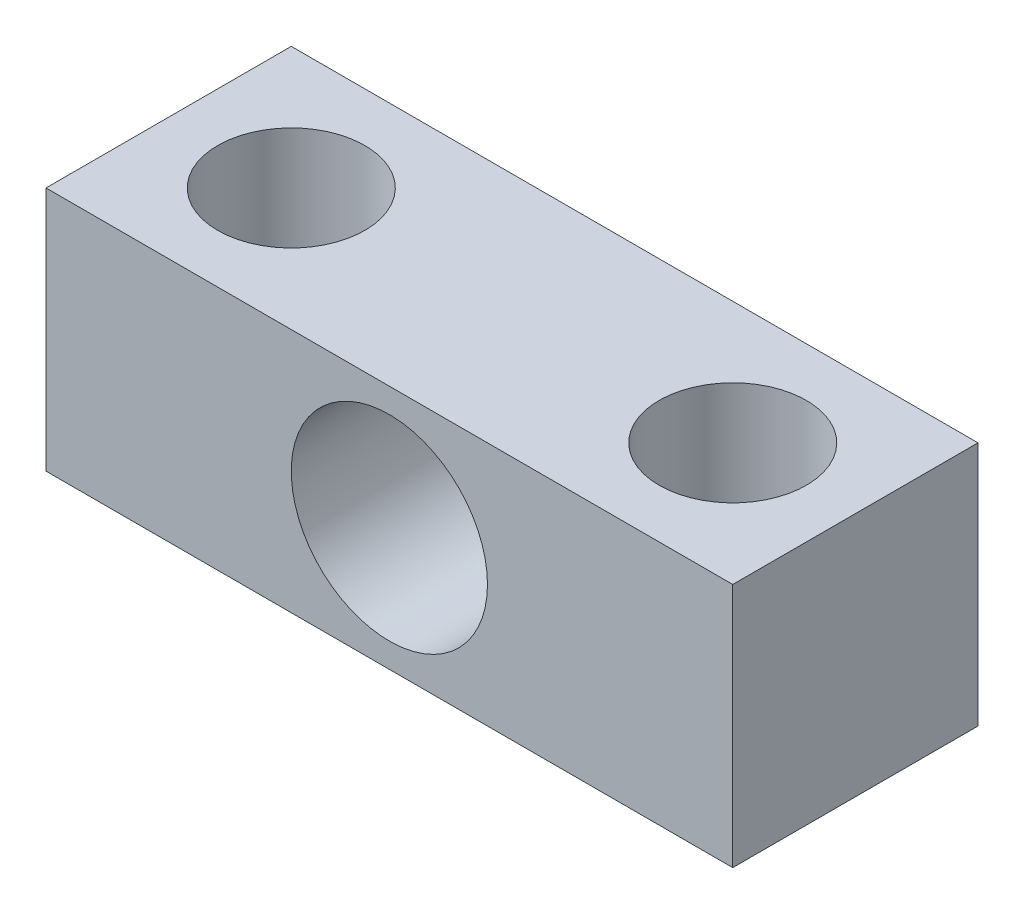
ISO-10303-21;
HEADER;
FILE_DESCRIPTION(('STEP AP214'),'2;1');
FILE_NAME('part.step','',(''),(''),'','','');
FILE_SCHEMA(('AUTOMOTIVE_DESIGN { 1 0 10303 214 1 1 1 1 }'));
ENDSEC;
DATA;
#1=APPLICATION_CONTEXT('core data for automotive mechanical design processes');
#2=APPLICATION_PROTOCOL_DEFINITION('international standard','automotive_design',2000,#1);
#3=PRODUCT_CONTEXT('',#1,'mechanical');
#4=PRODUCT('Part','Part','',(#3));
#5=PRODUCT_RELATED_PRODUCT_CATEGORY('part','',(#4));
#6=PRODUCT_DEFINITION_FORMATION('','',#4);
#7=PRODUCT_DEFINITION_CONTEXT('part definition',#1,'design');
#8=PRODUCT_DEFINITION('design','',#6,#7);
#9=PRODUCT_DEFINITION_SHAPE('','',#8);
#10=(LENGTH_UNIT() NAMED_UNIT(*) SI_UNIT(.MILLI.,.METRE.));
#11=(NAMED_UNIT(*) PLANE_ANGLE_UNIT() SI_UNIT($,.RADIAN.));
#12=(NAMED_UNIT(*) SI_UNIT($,.STERADIAN.) SOLID_ANGLE_UNIT());
#13=UNCERTAINTY_MEASURE_WITH_UNIT(LENGTH_MEASURE(1.E-05),#10,'distance_accuracy_value','');
#14=(GEOMETRIC_REPRESENTATION_CONTEXT(3) GLOBAL_UNCERTAINTY_ASSIGNED_CONTEXT((#13)) GLOBAL_UNIT_ASSIGNED_CONTEXT((#10,
#11,#12)) REPRESENTATION_CONTEXT('',''));
#15=CARTESIAN_POINT('',(0.,0.,0.));
#16=DIRECTION('',(0.,0.,1.));
#17=DIRECTION('',(1.,0.,0.));
#18=AXIS2_PLACEMENT_3D('',#15,#16,#17);
#19=CARTESIAN_POINT('',(0.,10.,0.));
#20=DIRECTION('',(1.,0.,0.));
#21=DIRECTION('',(0.,0.,-1.));
#22=AXIS2_PLACEMENT_3D('',#19,#20,#21);
#23=PLANE('',#22);
#24=DIRECTION('',(0.,0.,1.));
#25=VECTOR('',#24,1.);
#26=CARTESIAN_POINT('',(0.,0.,0.));
#27=LINE('',#26,#25);
#28=CARTESIAN_POINT('',(0.,0.,-10.));
#29=VERTEX_POINT('',#28);
#30=CARTESIAN_POINT('',(0.,0.,0.));
#31=VERTEX_POINT('',#30);
#32=EDGE_CURVE('E95',#29,#31,#27,.T.);
#33=ORIENTED_EDGE('',*,*,#32,.T.);
#34=DIRECTION('',(0.,-1.,0.));
#35=VECTOR('',#34,1.);
#36=CARTESIAN_POINT('',(0.,10.,0.));
#37=LINE('',#36,#35);
#38=CARTESIAN_POINT('',(0.,10.,0.));
#39=VERTEX_POINT('',#38);
#40=EDGE_CURVE('E11',#39,#31,#37,.T.);
#41=ORIENTED_EDGE('',*,*,#40,.F.);
#42=DIRECTION('',(0.,0.,1.));
#43=VECTOR('',#42,1.);
#44=CARTESIAN_POINT('',(0.,10.,0.));
#45=LINE('',#44,#43);
#46=CARTESIAN_POINT('',(0.,10.,-10.));
#47=VERTEX_POINT('',#46);
#48=EDGE_CURVE('E83',#47,#39,#45,.T.);
#49=ORIENTED_EDGE('',*,*,#48,.F.);
#50=DIRECTION('',(0.,-1.,0.));
#51=VECTOR('',#50,1.);
#52=CARTESIAN_POINT('',(0.,10.,-10.));
#53=LINE('',#52,#51);
#54=EDGE_CURVE('E91',#47,#29,#53,.T.);
#55=ORIENTED_EDGE('',*,*,#54,.T.);
#56=EDGE_LOOP('',(#33,#41,#49,#55));
#57=FACE_BOUND('',#56,.T.);
#58=ADVANCED_FACE('F32',(#57),#23,.F.);
#59=CARTESIAN_POINT('',(0.,10.,0.));
#60=DIRECTION('',(0.,0.,-1.));
#61=DIRECTION('',(-1.,0.,0.));
#62=AXIS2_PLACEMENT_3D('',#59,#60,#61);
#63=PLANE('',#62);
#64=CARTESIAN_POINT('',(14.,5.,0.));
#65=DIRECTION('',(0.,0.,1.));
#66=DIRECTION('',(1.,0.,0.));
#67=AXIS2_PLACEMENT_3D('',#64,#65,#66);
#68=CIRCLE('',#67,4.);
#69=CARTESIAN_POINT('',(18.,5.,0.));
#70=VERTEX_POINT('',#69);
#71=EDGE_CURVE('E109',#70,#70,#68,.T.);
#72=ORIENTED_EDGE('',*,*,#71,.F.);
#73=EDGE_LOOP('',(#72));
#74=FACE_BOUND('',#73,.T.);
#75=DIRECTION('',(1.,0.,0.));
#76=VECTOR('',#75,1.);
#77=CARTESIAN_POINT('',(0.,0.,0.));
#78=LINE('',#77,#76);
#79=CARTESIAN_POINT('',(28.,0.,0.));
#80=VERTEX_POINT('',#79);
#81=EDGE_CURVE('E87',#31,#80,#78,.T.);
#82=ORIENTED_EDGE('',*,*,#81,.T.);
#83=DIRECTION('',(0.,-1.,0.));
#84=VECTOR('',#83,1.);
#85=CARTESIAN_POINT('',(28.,10.,0.));
#86=LINE('',#85,#84);
#87=CARTESIAN_POINT('',(28.,10.,0.));
#88=VERTEX_POINT('',#87);
#89=EDGE_CURVE('E40',#88,#80,#86,.T.);
#90=ORIENTED_EDGE('',*,*,#89,.F.);
#91=DIRECTION('',(1.,0.,0.));
#92=VECTOR('',#91,1.);
#93=CARTESIAN_POINT('',(0.,10.,0.));
#94=LINE('',#93,#92);
#95=EDGE_CURVE('E78',#39,#88,#94,.T.);
#96=ORIENTED_EDGE('',*,*,#95,.F.);
#97=ORIENTED_EDGE('',*,*,#40,.T.);
#98=EDGE_LOOP('',(#82,#90,#96,#97));
#99=FACE_BOUND('',#98,.T.);
#100=ADVANCED_FACE('F86',(#74,#99),#63,.F.);
#101=CARTESIAN_POINT('',(28.,10.,0.));
#102=DIRECTION('',(-1.,0.,0.));
#103=DIRECTION('',(0.,0.,1.));
#104=AXIS2_PLACEMENT_3D('',#101,#102,#103);
#105=PLANE('',#104);
#106=DIRECTION('',(0.,0.,-1.));
#107=VECTOR('',#106,1.);
#108=CARTESIAN_POINT('',(28.,0.,0.));
#109=LINE('',#108,#107);
#110=CARTESIAN_POINT('',(28.,0.,-10.));
#111=VERTEX_POINT('',#110);
#112=EDGE_CURVE('E65',#80,#111,#109,.T.);
#113=ORIENTED_EDGE('',*,*,#112,.T.);
#114=DIRECTION('',(0.,-1.,0.));
#115=VECTOR('',#114,1.);
#116=CARTESIAN_POINT('',(28.,10.,-10.));
#117=LINE('',#116,#115);
#118=CARTESIAN_POINT('',(28.,10.,-10.));
#119=VERTEX_POINT('',#118);
#120=EDGE_CURVE('E88',#119,#111,#117,.T.);
#121=ORIENTED_EDGE('',*,*,#120,.F.);
#122=DIRECTION('',(0.,0.,-1.));
#123=VECTOR('',#122,1.);
#124=CARTESIAN_POINT('',(28.,10.,0.));
#125=LINE('',#124,#123);
#126=EDGE_CURVE('E81',#88,#119,#125,.T.);
#127=ORIENTED_EDGE('',*,*,#126,.F.);
#128=ORIENTED_EDGE('',*,*,#89,.T.);
#129=EDGE_LOOP('',(#113,#121,#127,#128));
#130=FACE_BOUND('',#129,.T.);
#131=ADVANCED_FACE('F89',(#130),#105,.F.);
#132=CARTESIAN_POINT('',(0.,10.,-10.));
#133=DIRECTION('',(0.,0.,1.));
#134=DIRECTION('',(1.,0.,0.));
#135=AXIS2_PLACEMENT_3D('',#132,#133,#134);
#136=PLANE('',#135);
#137=CARTESIAN_POINT('',(14.,5.,-10.));
#138=DIRECTION('',(0.,0.,1.));
#139=DIRECTION('',(1.,0.,0.));
#140=AXIS2_PLACEMENT_3D('',#137,#138,#139);
#141=CIRCLE('',#140,4.);
#142=CARTESIAN_POINT('',(18.,5.,-10.));
#143=VERTEX_POINT('',#142);
#144=EDGE_CURVE('E98',#143,#143,#141,.T.);
#145=ORIENTED_EDGE('',*,*,#144,.T.);
#146=EDGE_LOOP('',(#145));
#147=FACE_BOUND('',#146,.T.);
#148=DIRECTION('',(-1.,0.,0.));
#149=VECTOR('',#148,1.);
#150=CARTESIAN_POINT('',(0.,0.,-10.));
#151=LINE('',#150,#149);
#152=EDGE_CURVE('E71',#111,#29,#151,.T.);
#153=ORIENTED_EDGE('',*,*,#152,.T.);
#154=ORIENTED_EDGE('',*,*,#54,.F.);
#155=DIRECTION('',(-1.,0.,0.));
#156=VECTOR('',#155,1.);
#157=CARTESIAN_POINT('',(0.,10.,-10.));
#158=LINE('',#157,#156);
#159=EDGE_CURVE('E48',#119,#47,#158,.T.);
#160=ORIENTED_EDGE('',*,*,#159,.F.);
#161=ORIENTED_EDGE('',*,*,#120,.T.);
#162=EDGE_LOOP('',(#153,#154,#160,#161));
#163=FACE_BOUND('',#162,.T.);
#164=ADVANCED_FACE('F103',(#147,#163),#136,.F.);
#165=CARTESIAN_POINT('',(0.,10.,-10.));
#166=DIRECTION('',(0.,-1.,0.));
#167=DIRECTION('',(0.,0.,-1.));
#168=AXIS2_PLACEMENT_3D('',#165,#166,#167);
#169=PLANE('',#168);
#170=CARTESIAN_POINT('',(23.,10.,-5.));
#171=DIRECTION('',(0.,1.,0.));
#172=DIRECTION('',(0.,0.,1.));
#173=AXIS2_PLACEMENT_3D('',#170,#171,#172);
#174=CIRCLE('',#173,3.);
#175=CARTESIAN_POINT('',(23.,10.,-2.));
#176=VERTEX_POINT('',#175);
#177=EDGE_CURVE('E121',#176,#176,#174,.T.);
#178=ORIENTED_EDGE('',*,*,#177,.F.);
#179=EDGE_LOOP('',(#178));
#180=FACE_BOUND('',#179,.T.);
#181=CARTESIAN_POINT('',(5.,10.,-5.));
#182=DIRECTION('',(0.,1.,0.));
#183=DIRECTION('',(0.,0.,1.));
#184=AXIS2_PLACEMENT_3D('',#181,#182,#183);
#185=CIRCLE('',#184,3.);
#186=CARTESIAN_POINT('',(5.,10.,-2.));
#187=VERTEX_POINT('',#186);
#188=EDGE_CURVE('E115',#187,#187,#185,.T.);
#189=ORIENTED_EDGE('',*,*,#188,.F.);
#190=EDGE_LOOP('',(#189));
#191=FACE_BOUND('',#190,.T.);
#192=ORIENTED_EDGE('',*,*,#48,.T.);
#193=ORIENTED_EDGE('',*,*,#95,.T.);
#194=ORIENTED_EDGE('',*,*,#126,.T.);
#195=ORIENTED_EDGE('',*,*,#159,.T.);
#196=EDGE_LOOP('',(#192,#193,#194,#195));
#197=FACE_BOUND('',#196,.T.);
#198=ADVANCED_FACE('F79',(#180,#191,#197),#169,.F.);
#199=CARTESIAN_POINT('',(0.,0.,-10.));
#200=DIRECTION('',(0.,-1.,0.));
#201=DIRECTION('',(0.,0.,-1.));
#202=AXIS2_PLACEMENT_3D('',#199,#200,#201);
#203=PLANE('',#202);
#204=CARTESIAN_POINT('',(23.,0.,-5.));
#205=DIRECTION('',(0.,1.,0.));
#206=DIRECTION('',(0.,0.,1.));
#207=AXIS2_PLACEMENT_3D('',#204,#205,#206);
#208=CIRCLE('',#207,3.);
#209=CARTESIAN_POINT('',(23.,0.,-2.));
#210=VERTEX_POINT('',#209);
#211=EDGE_CURVE('E118',#210,#210,#208,.T.);
#212=ORIENTED_EDGE('',*,*,#211,.T.);
#213=EDGE_LOOP('',(#212));
#214=FACE_BOUND('',#213,.T.);
#215=CARTESIAN_POINT('',(5.,0.,-5.));
#216=DIRECTION('',(0.,1.,0.));
#217=DIRECTION('',(0.,0.,1.));
#218=AXIS2_PLACEMENT_3D('',#215,#216,#217);
#219=CIRCLE('',#218,3.);
#220=CARTESIAN_POINT('',(5.,0.,-2.));
#221=VERTEX_POINT('',#220);
#222=EDGE_CURVE('E112',#221,#221,#219,.T.);
#223=ORIENTED_EDGE('',*,*,#222,.T.);
#224=EDGE_LOOP('',(#223));
#225=FACE_BOUND('',#224,.T.);
#226=ORIENTED_EDGE('',*,*,#32,.F.);
#227=ORIENTED_EDGE('',*,*,#152,.F.);
#228=ORIENTED_EDGE('',*,*,#112,.F.);
#229=ORIENTED_EDGE('',*,*,#81,.F.);
#230=EDGE_LOOP('',(#226,#227,#228,#229));
#231=FACE_BOUND('',#230,.T.);
#232=ADVANCED_FACE('F106',(#214,#225,#231),#203,.T.);
#233=CARTESIAN_POINT('',(14.,5.,-10.));
#234=DIRECTION('',(0.,0.,1.));
#235=DIRECTION('',(1.,0.,0.));
#236=AXIS2_PLACEMENT_3D('',#233,#234,#235);
#237=CYLINDRICAL_SURFACE('',#236,4.);
#238=ORIENTED_EDGE('',*,*,#144,.F.);
#239=EDGE_LOOP('',(#238));
#240=FACE_BOUND('',#239,.T.);
#241=ORIENTED_EDGE('',*,*,#71,.T.);
#242=EDGE_LOOP('',(#241));
#243=FACE_BOUND('',#242,.T.);
#244=ADVANCED_FACE('F142',(#240,#243),#237,.F.);
#245=CARTESIAN_POINT('',(5.,0.,-5.));
#246=DIRECTION('',(0.,1.,0.));
#247=DIRECTION('',(0.,0.,1.));
#248=AXIS2_PLACEMENT_3D('',#245,#246,#247);
#249=CYLINDRICAL_SURFACE('',#248,3.);
#250=ORIENTED_EDGE('',*,*,#222,.F.);
#251=EDGE_LOOP('',(#250));
#252=FACE_BOUND('',#251,.T.);
#253=ORIENTED_EDGE('',*,*,#188,.T.);
#254=EDGE_LOOP('',(#253));
#255=FACE_BOUND('',#254,.T.);
#256=ADVANCED_FACE('F132',(#252,#255),#249,.F.);
#257=CARTESIAN_POINT('',(23.,0.,-5.));
#258=DIRECTION('',(0.,1.,0.));
#259=DIRECTION('',(0.,0.,1.));
#260=AXIS2_PLACEMENT_3D('',#257,#258,#259);
#261=CYLINDRICAL_SURFACE('',#260,3.);
#262=ORIENTED_EDGE('',*,*,#211,.F.);
#263=EDGE_LOOP('',(#262));
#264=FACE_BOUND('',#263,.T.);
#265=ORIENTED_EDGE('',*,*,#177,.T.);
#266=EDGE_LOOP('',(#265));
#267=FACE_BOUND('',#266,.T.);
#268=ADVANCED_FACE('F129',(#264,#267),#261,.F.);
#269=CLOSED_SHELL('',(#58,#100,#131,#164,#198,#232,#244,#256,#268));
#270=MANIFOLD_SOLID_BREP('B2',#269);
#271=ADVANCED_BREP_SHAPE_REPRESENTATION('',(#18,#270),#14);
#272=SHAPE_DEFINITION_REPRESENTATION(#9,#271);
ENDSEC;
END-ISO-10303-21;
